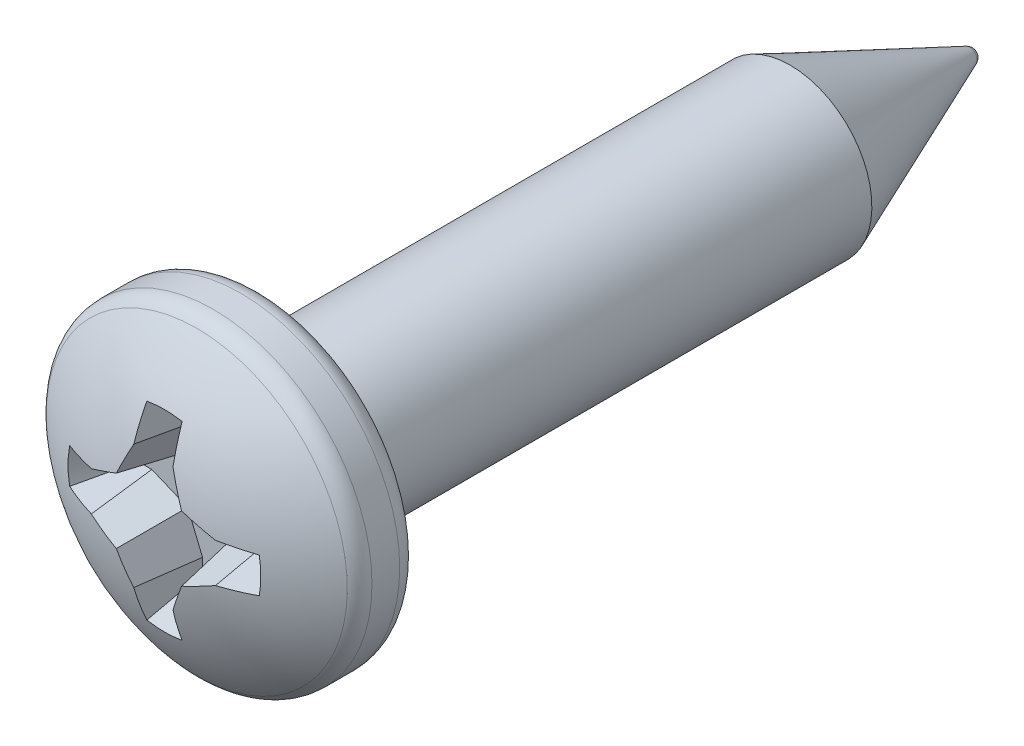
ISO-10303-21;
HEADER;
FILE_DESCRIPTION(('STEP AP214'),'2;1');
FILE_NAME('part.step','',(''),(''),'','','');
FILE_SCHEMA(('AUTOMOTIVE_DESIGN { 1 0 10303 214 1 1 1 1 }'));
ENDSEC;
DATA;
#1=APPLICATION_CONTEXT('core data for automotive mechanical design processes');
#2=APPLICATION_PROTOCOL_DEFINITION('international standard','automotive_design',2000,#1);
#3=PRODUCT_CONTEXT('',#1,'mechanical');
#4=PRODUCT('Part','Part','',(#3));
#5=PRODUCT_RELATED_PRODUCT_CATEGORY('part','',(#4));
#6=PRODUCT_DEFINITION_FORMATION('','',#4);
#7=PRODUCT_DEFINITION_CONTEXT('part definition',#1,'design');
#8=PRODUCT_DEFINITION('design','',#6,#7);
#9=PRODUCT_DEFINITION_SHAPE('','',#8);
#10=(LENGTH_UNIT() NAMED_UNIT(*) SI_UNIT(.MILLI.,.METRE.));
#11=(NAMED_UNIT(*) PLANE_ANGLE_UNIT() SI_UNIT($,.RADIAN.));
#12=(NAMED_UNIT(*) SI_UNIT($,.STERADIAN.) SOLID_ANGLE_UNIT());
#13=UNCERTAINTY_MEASURE_WITH_UNIT(LENGTH_MEASURE(1.E-05),#10,'distance_accuracy_value','');
#14=(GEOMETRIC_REPRESENTATION_CONTEXT(3) GLOBAL_UNCERTAINTY_ASSIGNED_CONTEXT((#13)) GLOBAL_UNIT_ASSIGNED_CONTEXT((#10,
#11,#12)) REPRESENTATION_CONTEXT('',''));
#15=CARTESIAN_POINT('',(0.,0.,0.));
#16=DIRECTION('',(0.,0.,1.));
#17=DIRECTION('',(1.,0.,0.));
#18=AXIS2_PLACEMENT_3D('',#15,#16,#17);
#19=CARTESIAN_POINT('',(0.,0.,0.));
#20=DIRECTION('',(0.,0.,-1.));
#21=DIRECTION('',(0.,1.,0.));
#22=AXIS2_PLACEMENT_3D('',#19,#20,#21);
#23=CYLINDRICAL_SURFACE('',#22,1.0922);
#24=CARTESIAN_POINT('',(0.,0.,0.));
#25=DIRECTION('',(0.,0.,-1.));
#26=DIRECTION('',(0.,1.,0.));
#27=AXIS2_PLACEMENT_3D('',#24,#25,#26);
#28=CIRCLE('',#27,1.0922);
#29=CARTESIAN_POINT('',(0.,1.0922,0.));
#30=VERTEX_POINT('',#29);
#31=EDGE_CURVE('E339',#30,#30,#28,.T.);
#32=ORIENTED_EDGE('',*,*,#31,.T.);
#33=EDGE_LOOP('',(#32));
#34=FACE_BOUND('',#33,.T.);
#35=CARTESIAN_POINT('',(0.,0.,-7.0588450080274));
#36=DIRECTION('',(0.,0.,-1.));
#37=DIRECTION('',(0.,1.,0.));
#38=AXIS2_PLACEMENT_3D('',#35,#36,#37);
#39=CIRCLE('',#38,1.0922);
#40=CARTESIAN_POINT('',(0.,1.0922,-7.0588450080274));
#41=VERTEX_POINT('',#40);
#42=EDGE_CURVE('E11',#41,#41,#39,.T.);
#43=ORIENTED_EDGE('',*,*,#42,.F.);
#44=EDGE_LOOP('',(#43));
#45=FACE_BOUND('',#44,.T.);
#46=ADVANCED_FACE('F17',(#34,#45),#23,.T.);
#47=CARTESIAN_POINT('',(0.,0.,-9.45749429763476));
#48=DIRECTION('',(0.,0.,1.));
#49=DIRECTION('',(0.,-1.,0.));
#50=AXIS2_PLACEMENT_3D('',#47,#48,#49);
#51=CONICAL_SURFACE('',#50,0.100940208900311,0.391882749363197);
#52=CARTESIAN_POINT('',(0.,0.,-9.45749429763476));
#53=DIRECTION('',(0.,0.,-1.));
#54=DIRECTION('',(0.,1.,0.));
#55=AXIS2_PLACEMENT_3D('',#52,#53,#54);
#56=CIRCLE('',#55,0.100940208900311);
#57=CARTESIAN_POINT('',(0.,0.100940208900313,-9.45749429763476));
#58=VERTEX_POINT('',#57);
#59=EDGE_CURVE('E26',#58,#58,#56,.T.);
#60=ORIENTED_EDGE('',*,*,#59,.F.);
#61=EDGE_LOOP('',(#60));
#62=FACE_BOUND('',#61,.T.);
#63=ORIENTED_EDGE('',*,*,#42,.T.);
#64=EDGE_LOOP('',(#63));
#65=FACE_BOUND('',#64,.T.);
#66=ADVANCED_FACE('F1027',(#62,#65),#51,.T.);
#67=CARTESIAN_POINT('',(0.,0.,-9.41578));
#68=DIRECTION('',(-1.,0.,0.));
#69=DIRECTION('',(0.,-1.,0.));
#70=AXIS2_PLACEMENT_3D('',#67,#68,#69);
#71=SPHERICAL_SURFACE('',#70,0.10922);
#72=CARTESIAN_POINT('',(0.,0.,-9.41578));
#73=DIRECTION('',(0.,0.,-1.));
#74=DIRECTION('',(0.,1.,0.));
#75=AXIS2_PLACEMENT_3D('',#72,#73,#74);
#76=SPHERICAL_SURFACE('',#75,0.10922);
#77=ORIENTED_EDGE('',*,*,#59,.T.);
#78=EDGE_LOOP('',(#77));
#79=FACE_BOUND('',#78,.T.);
#80=ADVANCED_FACE('F1018',(#79),#76,.T.);
#81=CARTESIAN_POINT('',(0.28278666666582,0.,1.5748));
#82=DIRECTION('',(-0.984807753012208,0.,0.17364817766693));
#83=DIRECTION('',(0.,1.,0.));
#84=AXIS2_PLACEMENT_3D('',#81,#82,#83);
#85=PLANE('',#84);
#86=DIRECTION('',(0.173544683499999,-0.0345201838411363,0.984220808424847));
#87=VECTOR('',#86,1.);
#88=CARTESIAN_POINT('',(0.286754779056707,-0.834865679356377,1.59730428366059));
#89=LINE('',#88,#87);
#90=CARTESIAN_POINT('',(0.124112535683148,-0.802514125691006,0.674914285714286));
#91=VERTEX_POINT('',#90);
#92=CARTESIAN_POINT('',(0.261860861000745,-0.829913971182511,1.45612385877075));
#93=VERTEX_POINT('',#92);
#94=EDGE_CURVE('E20',#91,#93,#89,.T.);
#95=ORIENTED_EDGE('',*,*,#94,.F.);
#96=DIRECTION('',(0.,1.,0.));
#97=VECTOR('',#96,1.);
#98=CARTESIAN_POINT('',(0.12411253568314,0.,0.674914285714286));
#99=LINE('',#98,#97);
#100=CARTESIAN_POINT('',(0.12411253568315,-0.986533285909944,0.674914285714286));
#101=VERTEX_POINT('',#100);
#102=EDGE_CURVE('E372',#101,#91,#99,.T.);
#103=ORIENTED_EDGE('',*,*,#102,.F.);
#104=CARTESIAN_POINT('',(0.12411253568315,-0.986533285909944,0.674914285714286));
#105=CARTESIAN_POINT('',(0.161275676182195,-1.08091285069469,0.885676928786412));
#106=CARTESIAN_POINT('',(0.198497913416884,-1.17453210642862,1.09677472610099));
#107=CARTESIAN_POINT('',(0.235747271018573,-1.26780244508165,1.30802633065989));
#108=(BOUNDED_CURVE() B_SPLINE_CURVE(3,(#104,#105,#106,#107),.UNSPECIFIED.,.F.,
.F.) B_SPLINE_CURVE_WITH_KNOTS((4,4),(0.00292428673741065,0.00362601514853769),
.UNSPECIFIED.) CURVE() GEOMETRIC_REPRESENTATION_ITEM() RATIONAL_B_SPLINE_CURVE((1.,1.,1.,1.)) REPRESENTATION_ITEM(''));
#109=CARTESIAN_POINT('',(0.235747271018573,-1.26780244508165,1.30802633065989));
#110=VERTEX_POINT('',#109);
#111=EDGE_CURVE('E386',#101,#110,#108,.T.);
#112=ORIENTED_EDGE('',*,*,#111,.T.);
#113=CARTESIAN_POINT('',(-0.281535677542724,0.,-1.62563105111396));
#114=DIRECTION('',(0.984807753012208,0.,-0.17364817766693));
#115=DIRECTION('',(0.17364817766693,0.,0.984807753012208));
#116=AXIS2_PLACEMENT_3D('',#113,#114,#115);
#117=CIRCLE('',#116,3.23747591840672);
#118=EDGE_CURVE('E292',#93,#110,#117,.T.);
#119=ORIENTED_EDGE('',*,*,#118,.F.);
#120=EDGE_LOOP('',(#95,#103,#112,#119));
#121=FACE_BOUND('',#120,.T.);
#122=ADVANCED_FACE('F1009',(#121),#85,.T.);
#123=CARTESIAN_POINT('',(0.536264047738441,-0.222127841586348,1.5748));
#124=DIRECTION('',(-0.909843726466413,0.376869611142453,0.17364817766693));
#125=DIRECTION('',(0.187471112631058,0.,0.982270116581418));
#126=AXIS2_PLACEMENT_3D('',#123,#124,#125);
#127=PLANE('',#126);
#128=DIRECTION('',(0.13256209501801,-0.132562095018007,0.982270116581418));
#129=VECTOR('',#128,1.);
#130=CARTESIAN_POINT('',(0.44196913146317,-0.44196913146316,1.55785691069535));
#131=LINE('',#130,#129);
#132=CARTESIAN_POINT('',(0.322811761028712,-0.322811761028705,0.674914285714286));
#133=VERTEX_POINT('',#132);
#134=CARTESIAN_POINT('',(0.436279560050289,-0.43627956005028,1.51569783064859));
#135=VERTEX_POINT('',#134);
#136=EDGE_CURVE('E293',#133,#135,#131,.T.);
#137=ORIENTED_EDGE('',*,*,#136,.F.);
#138=DIRECTION('',(0.38268343236508,0.923879532511291,0.));
#139=VECTOR('',#138,1.);
#140=CARTESIAN_POINT('',(0.389668265784527,-0.161405880514349,0.674914285714286));
#141=LINE('',#140,#139);
#142=EDGE_CURVE('E316',#91,#133,#141,.T.);
#143=ORIENTED_EDGE('',*,*,#142,.F.);
#144=ORIENTED_EDGE('',*,*,#94,.T.);
#145=CARTESIAN_POINT('',(0.00660582201618942,-0.00273622106972879,-1.67653414091827));
#146=DIRECTION('',(0.909843726466413,-0.376869611142454,-0.173648177666931));
#147=DIRECTION('',(-0.382683432365082,-0.92387953251129,0.));
#148=AXIS2_PLACEMENT_3D('',#145,#146,#147);
#149=CIRCLE('',#148,3.25006527753279);
#150=EDGE_CURVE('E300',#135,#93,#149,.T.);
#151=ORIENTED_EDGE('',*,*,#150,.F.);
#152=EDGE_LOOP('',(#137,#143,#144,#151));
#153=FACE_BOUND('',#152,.T.);
#154=ADVANCED_FACE('F1000',(#153),#127,.T.);
#155=CARTESIAN_POINT('',(0.22212784158636,-0.536264047738436,1.5748));
#156=DIRECTION('',(-0.376869611142473,0.909843726466405,0.17364817766693));
#157=DIRECTION('',(0.418478680382117,0.,0.908226620434372));
#158=AXIS2_PLACEMENT_3D('',#155,#156,#157);
#159=PLANE('',#158);
#160=DIRECTION('',(0.0345201838411398,-0.173544683499998,0.984220808424847));
#161=VECTOR('',#160,1.);
#162=CARTESIAN_POINT('',(0.83308245137857,-0.277789886620364,1.54646185217162));
#163=LINE('',#162,#161);
#164=CARTESIAN_POINT('',(0.802514125691008,-0.124112535683131,0.674914285714286));
#165=VERTEX_POINT('',#164);
#166=CARTESIAN_POINT('',(0.829913971182516,-0.261860861000727,1.45612385877075));
#167=VERTEX_POINT('',#166);
#168=EDGE_CURVE('E296',#165,#167,#163,.T.);
#169=ORIENTED_EDGE('',*,*,#168,.F.);
#170=DIRECTION('',(0.923879532511283,0.382683432365099,0.));
#171=VECTOR('',#170,1.);
#172=CARTESIAN_POINT('',(0.161405880514359,-0.389668265784523,0.674914285714286));
#173=LINE('',#172,#171);
#174=EDGE_CURVE('E311',#133,#165,#173,.T.);
#175=ORIENTED_EDGE('',*,*,#174,.F.);
#176=ORIENTED_EDGE('',*,*,#136,.T.);
#177=CARTESIAN_POINT('',(0.00273622106972846,-0.0066058220161897,-1.67653414091827));
#178=DIRECTION('',(0.376869611142473,-0.909843726466405,-0.17364817766693));
#179=DIRECTION('',(-0.923879532511282,-0.382683432365102,0.));
#180=AXIS2_PLACEMENT_3D('',#177,#178,#179);
#181=CIRCLE('',#180,3.25006527753279);
#182=EDGE_CURVE('E273',#167,#135,#181,.T.);
#183=ORIENTED_EDGE('',*,*,#182,.F.);
#184=EDGE_LOOP('',(#169,#175,#176,#183));
#185=FACE_BOUND('',#184,.T.);
#186=ADVANCED_FACE('F991',(#185),#159,.T.);
#187=CARTESIAN_POINT('',(0.,-0.28278666666582,1.5748));
#188=DIRECTION('',(0.,0.984807753012208,0.17364817766693));
#189=DIRECTION('',(1.,0.,0.));
#190=AXIS2_PLACEMENT_3D('',#187,#188,#189);
#191=PLANE('',#190);
#192=CARTESIAN_POINT('',(0.986533285909945,-0.124112535683129,0.674914285714286));
#193=CARTESIAN_POINT('',(1.08091458900162,-0.161276360662385,0.885680810666597));
#194=CARTESIAN_POINT('',(1.17453418753103,-0.198498744546334,1.09677943967048));
#195=CARTESIAN_POINT('',(1.26780244508165,-0.235747271018547,1.30802633065989));
#196=(BOUNDED_CURVE() B_SPLINE_CURVE(3,(#192,#193,#194,#195),.UNSPECIFIED.,.F.,
.F.) B_SPLINE_CURVE_WITH_KNOTS((4,4),(0.00112904032255537,0.00183072607387625),
.UNSPECIFIED.) CURVE() GEOMETRIC_REPRESENTATION_ITEM() RATIONAL_B_SPLINE_CURVE((1.,1.,1.,1.)) REPRESENTATION_ITEM(''));
#197=CARTESIAN_POINT('',(0.986533285909945,-0.124112535683129,0.674914285714286));
#198=VERTEX_POINT('',#197);
#199=CARTESIAN_POINT('',(1.26780244508165,-0.235747271018547,1.30802633065989));
#200=VERTEX_POINT('',#199);
#201=EDGE_CURVE('E408',#198,#200,#196,.T.);
#202=ORIENTED_EDGE('',*,*,#201,.F.);
#203=DIRECTION('',(1.,0.,0.));
#204=VECTOR('',#203,1.);
#205=CARTESIAN_POINT('',(0.,-0.12411253568314,0.674914285714286));
#206=LINE('',#205,#204);
#207=EDGE_CURVE('E315',#165,#198,#206,.T.);
#208=ORIENTED_EDGE('',*,*,#207,.F.);
#209=ORIENTED_EDGE('',*,*,#168,.T.);
#210=CARTESIAN_POINT('',(0.,0.281535677542724,-1.62563105111396));
#211=DIRECTION('',(0.,-0.984807753012208,-0.17364817766693));
#212=DIRECTION('',(0.,-0.17364817766693,0.984807753012208));
#213=AXIS2_PLACEMENT_3D('',#210,#211,#212);
#214=CIRCLE('',#213,3.23747591840672);
#215=EDGE_CURVE('E269',#200,#167,#214,.T.);
#216=ORIENTED_EDGE('',*,*,#215,.F.);
#217=EDGE_LOOP('',(#202,#208,#209,#216));
#218=FACE_BOUND('',#217,.T.);
#219=ADVANCED_FACE('F983',(#218),#191,.T.);
#220=CARTESIAN_POINT('',(0.,-0.282786666665821,1.5748));
#221=DIRECTION('',(0.,0.984807753012208,0.17364817766693));
#222=DIRECTION('',(1.,0.,0.));
#223=AXIS2_PLACEMENT_3D('',#220,#221,#222);
#224=PLANE('',#223);
#225=DIRECTION('',(-0.0345201838411369,-0.173544683499999,0.984220808424847));
#226=VECTOR('',#225,1.);
#227=CARTESIAN_POINT('',(-0.834865679356378,-0.286754779056705,1.59730428366059));
#228=LINE('',#227,#226);
#229=CARTESIAN_POINT('',(-0.802514125691006,-0.124112535683146,0.674914285714286));
#230=VERTEX_POINT('',#229);
#231=CARTESIAN_POINT('',(-0.829913971182511,-0.261860861000742,1.45612385877075));
#232=VERTEX_POINT('',#231);
#233=EDGE_CURVE('E359',#230,#232,#228,.T.);
#234=ORIENTED_EDGE('',*,*,#233,.F.);
#235=DIRECTION('',(1.,0.,0.));
#236=VECTOR('',#235,1.);
#237=CARTESIAN_POINT('',(0.,-0.12411253568314,0.674914285714286));
#238=LINE('',#237,#236);
#239=CARTESIAN_POINT('',(-0.986533285909944,-0.124112535683147,0.674914285714286));
#240=VERTEX_POINT('',#239);
#241=EDGE_CURVE('E268',#240,#230,#238,.T.);
#242=ORIENTED_EDGE('',*,*,#241,.F.);
#243=CARTESIAN_POINT('',(-0.986533285909944,-0.124112535683147,0.674914285714286));
#244=CARTESIAN_POINT('',(-1.08091285069469,-0.161275676182192,0.885676928786412));
#245=CARTESIAN_POINT('',(-1.17453210642862,-0.198497913416881,1.09677472610099));
#246=CARTESIAN_POINT('',(-1.26780244508165,-0.23574727101857,1.30802633065989));
#247=(BOUNDED_CURVE() B_SPLINE_CURVE(3,(#243,#244,#245,#246),.UNSPECIFIED.,.F.,
.F.) B_SPLINE_CURVE_WITH_KNOTS((4,4),(0.00292428673741065,0.00362601514853769),
.UNSPECIFIED.) CURVE() GEOMETRIC_REPRESENTATION_ITEM() RATIONAL_B_SPLINE_CURVE((1.,1.,1.,1.)) REPRESENTATION_ITEM(''));
#248=CARTESIAN_POINT('',(-1.26780244508165,-0.23574727101857,1.30802633065989));
#249=VERTEX_POINT('',#248);
#250=EDGE_CURVE('E452',#240,#249,#247,.T.);
#251=ORIENTED_EDGE('',*,*,#250,.T.);
#252=CARTESIAN_POINT('',(0.,0.281535677542724,-1.62563105111396));
#253=DIRECTION('',(0.,-0.984807753012208,-0.17364817766693));
#254=DIRECTION('',(0.,-0.17364817766693,0.984807753012208));
#255=AXIS2_PLACEMENT_3D('',#252,#253,#254);
#256=CIRCLE('',#255,3.23747591840672);
#257=EDGE_CURVE('E320',#232,#249,#256,.T.);
#258=ORIENTED_EDGE('',*,*,#257,.F.);
#259=EDGE_LOOP('',(#234,#242,#251,#258));
#260=FACE_BOUND('',#259,.T.);
#261=ADVANCED_FACE('F496',(#260),#224,.T.);
#262=CARTESIAN_POINT('',(-0.22212784158635,-0.53626404773844,1.5748));
#263=DIRECTION('',(0.376869611142457,0.909843726466412,0.17364817766693));
#264=DIRECTION('',(0.418478680382132,0.,-0.908226620434366));
#265=AXIS2_PLACEMENT_3D('',#262,#263,#264);
#266=PLANE('',#265);
#267=DIRECTION('',(-0.132562095018008,-0.13256209501801,0.982270116581418));
#268=VECTOR('',#267,1.);
#269=CARTESIAN_POINT('',(-0.441969131463161,-0.441969131463169,1.55785691069535));
#270=LINE('',#269,#268);
#271=CARTESIAN_POINT('',(-0.322811761028706,-0.322811761028711,0.674914285714286));
#272=VERTEX_POINT('',#271);
#273=CARTESIAN_POINT('',(-0.436279560050281,-0.436279560050288,1.51569783064859));
#274=VERTEX_POINT('',#273);
#275=EDGE_CURVE('E482',#272,#274,#270,.T.);
#276=ORIENTED_EDGE('',*,*,#275,.F.);
#277=DIRECTION('',(0.92387953251129,-0.382683432365084,0.));
#278=VECTOR('',#277,1.);
#279=CARTESIAN_POINT('',(-0.161405880514352,-0.389668265784527,0.674914285714286));
#280=LINE('',#279,#278);
#281=EDGE_CURVE('E432',#230,#272,#280,.T.);
#282=ORIENTED_EDGE('',*,*,#281,.F.);
#283=ORIENTED_EDGE('',*,*,#233,.T.);
#284=CARTESIAN_POINT('',(-0.00273622106972847,-0.00660582201619004,-1.67653414091827));
#285=DIRECTION('',(-0.376869611142457,-0.909843726466412,-0.173648177666931));
#286=DIRECTION('',(-0.923879532511289,0.382683432365085,0.));
#287=AXIS2_PLACEMENT_3D('',#284,#285,#286);
#288=CIRCLE('',#287,3.25006527753279);
#289=EDGE_CURVE('E310',#274,#232,#288,.T.);
#290=ORIENTED_EDGE('',*,*,#289,.F.);
#291=EDGE_LOOP('',(#276,#282,#283,#290));
#292=FACE_BOUND('',#291,.T.);
#293=ADVANCED_FACE('F492',(#292),#266,.T.);
#294=CARTESIAN_POINT('',(-0.536264047738437,-0.222127841586358,1.5748));
#295=DIRECTION('',(0.909843726466407,0.37686961114247,0.17364817766693));
#296=DIRECTION('',(0.,0.41847868038212,-0.908226620434371));
#297=AXIS2_PLACEMENT_3D('',#294,#295,#296);
#298=PLANE('',#297);
#299=DIRECTION('',(-0.173544683499998,-0.0345201838411393,0.984220808424847));
#300=VECTOR('',#299,1.);
#301=CARTESIAN_POINT('',(-0.277789886620367,-0.833082451378569,1.54646185217162));
#302=LINE('',#301,#300);
#303=CARTESIAN_POINT('',(-0.124112535683134,-0.802514125691009,0.674914285714286));
#304=VERTEX_POINT('',#303);
#305=CARTESIAN_POINT('',(-0.26186086100073,-0.829913971182516,1.45612385877075));
#306=VERTEX_POINT('',#305);
#307=EDGE_CURVE('E385',#304,#306,#302,.T.);
#308=ORIENTED_EDGE('',*,*,#307,.F.);
#309=DIRECTION('',(0.382683432365096,-0.923879532511284,0.));
#310=VECTOR('',#309,1.);
#311=CARTESIAN_POINT('',(-0.389668265784523,-0.161405880514356,0.674914285714286));
#312=LINE('',#311,#310);
#313=EDGE_CURVE('E436',#272,#304,#312,.T.);
#314=ORIENTED_EDGE('',*,*,#313,.F.);
#315=ORIENTED_EDGE('',*,*,#275,.T.);
#316=CARTESIAN_POINT('',(-0.00660582201618928,-0.00273622106972887,-1.67653414091827));
#317=DIRECTION('',(-0.909843726466407,-0.37686961114247,-0.17364817766693));
#318=DIRECTION('',(-0.382683432365099,0.923879532511283,0.));
#319=AXIS2_PLACEMENT_3D('',#316,#317,#318);
#320=CIRCLE('',#319,3.25006527753279);
#321=EDGE_CURVE('E278',#306,#274,#320,.T.);
#322=ORIENTED_EDGE('',*,*,#321,.F.);
#323=EDGE_LOOP('',(#308,#314,#315,#322));
#324=FACE_BOUND('',#323,.T.);
#325=ADVANCED_FACE('F501',(#324),#298,.T.);
#326=CARTESIAN_POINT('',(-0.28278666666582,0.,1.5748));
#327=DIRECTION('',(0.984807753012208,0.,0.17364817766693));
#328=DIRECTION('',(0.,-1.,0.));
#329=AXIS2_PLACEMENT_3D('',#326,#327,#328);
#330=PLANE('',#329);
#331=CARTESIAN_POINT('',(-0.124112535683132,-0.986533285909946,0.674914285714286));
#332=CARTESIAN_POINT('',(-0.161276360662388,-1.08091458900162,0.885680810666597));
#333=CARTESIAN_POINT('',(-0.198498744546339,-1.17453418753103,1.09677943967048));
#334=CARTESIAN_POINT('',(-0.235747271018551,-1.26780244508165,1.30802633065989));
#335=(BOUNDED_CURVE() B_SPLINE_CURVE(3,(#331,#332,#333,#334),.UNSPECIFIED.,.F.,
.F.) B_SPLINE_CURVE_WITH_KNOTS((4,4),(0.00112904032255537,0.00183072607387625),
.UNSPECIFIED.) CURVE() GEOMETRIC_REPRESENTATION_ITEM() RATIONAL_B_SPLINE_CURVE((1.,1.,1.,1.)) REPRESENTATION_ITEM(''));
#336=CARTESIAN_POINT('',(-0.124112535683132,-0.986533285909946,0.674914285714286));
#337=VERTEX_POINT('',#336);
#338=CARTESIAN_POINT('',(-0.235747271018551,-1.26780244508165,1.30802633065989));
#339=VERTEX_POINT('',#338);
#340=EDGE_CURVE('E380',#337,#339,#335,.T.);
#341=ORIENTED_EDGE('',*,*,#340,.F.);
#342=DIRECTION('',(0.,-1.,0.));
#343=VECTOR('',#342,1.);
#344=CARTESIAN_POINT('',(-0.124112535683139,0.,0.674914285714286));
#345=LINE('',#344,#343);
#346=EDGE_CURVE('E373',#304,#337,#345,.T.);
#347=ORIENTED_EDGE('',*,*,#346,.F.);
#348=ORIENTED_EDGE('',*,*,#307,.T.);
#349=CARTESIAN_POINT('',(0.281535677542725,0.,-1.62563105111396));
#350=DIRECTION('',(-0.984807753012208,0.,-0.173648177666931));
#351=DIRECTION('',(0.173648177666931,0.,-0.984807753012208));
#352=AXIS2_PLACEMENT_3D('',#349,#350,#351);
#353=CIRCLE('',#352,3.23747591840672);
#354=EDGE_CURVE('E275',#339,#306,#353,.T.);
#355=ORIENTED_EDGE('',*,*,#354,.F.);
#356=EDGE_LOOP('',(#341,#347,#348,#355));
#357=FACE_BOUND('',#356,.T.);
#358=ADVANCED_FACE('F907',(#357),#330,.T.);
#359=CARTESIAN_POINT('',(0.,0.,1.5748));
#360=DIRECTION('',(0.,0.,1.));
#361=DIRECTION('',(1.,0.,0.));
#362=AXIS2_PLACEMENT_3D('',#359,#360,#361);
#363=CONICAL_SURFACE('',#362,1.4139333333291,0.436332312998583);
#364=ORIENTED_EDGE('',*,*,#111,.F.);
#365=CARTESIAN_POINT('',(0.,0.,0.674914285714286));
#366=DIRECTION('',(0.,0.,1.));
#367=DIRECTION('',(1.,0.,0.));
#368=AXIS2_PLACEMENT_3D('',#365,#366,#367);
#369=CIRCLE('',#368,0.994309733293389);
#370=EDGE_CURVE('E368',#337,#101,#369,.T.);
#371=ORIENTED_EDGE('',*,*,#370,.F.);
#372=ORIENTED_EDGE('',*,*,#340,.T.);
#373=CARTESIAN_POINT('',(0.,0.,1.30802633065989));
#374=DIRECTION('',(0.,0.,-1.));
#375=DIRECTION('',(-1.,0.,0.));
#376=AXIS2_PLACEMENT_3D('',#373,#374,#375);
#377=CIRCLE('',#376,1.2895347283217);
#378=EDGE_CURVE('E279',#110,#339,#377,.T.);
#379=ORIENTED_EDGE('',*,*,#378,.F.);
#380=EDGE_LOOP('',(#364,#371,#372,#379));
#381=FACE_BOUND('',#380,.T.);
#382=ADVANCED_FACE('F911',(#381),#363,.F.);
#383=CARTESIAN_POINT('',(-0.28278666666582,0.,1.5748));
#384=DIRECTION('',(0.984807753012208,0.,0.17364817766693));
#385=DIRECTION('',(0.,-1.,0.));
#386=AXIS2_PLACEMENT_3D('',#383,#384,#385);
#387=PLANE('',#386);
#388=DIRECTION('',(-0.173544683499999,0.0345201838411375,0.984220808424847));
#389=VECTOR('',#388,1.);
#390=CARTESIAN_POINT('',(-0.286754779056702,0.834865679356378,1.59730428366059));
#391=LINE('',#390,#389);
#392=CARTESIAN_POINT('',(-0.124112535683143,0.802514125691005,0.674914285714286));
#393=VERTEX_POINT('',#392);
#394=CARTESIAN_POINT('',(-0.261860861000739,0.829913971182511,1.45612385877075));
#395=VERTEX_POINT('',#394);
#396=EDGE_CURVE('E470',#393,#395,#391,.T.);
#397=ORIENTED_EDGE('',*,*,#396,.F.);
#398=DIRECTION('',(0.,-1.,0.));
#399=VECTOR('',#398,1.);
#400=CARTESIAN_POINT('',(-0.12411253568314,0.,0.674914285714286));
#401=LINE('',#400,#399);
#402=CARTESIAN_POINT('',(-0.124112535683143,0.986533285909944,0.674914285714286));
#403=VERTEX_POINT('',#402);
#404=EDGE_CURVE('E407',#403,#393,#401,.T.);
#405=ORIENTED_EDGE('',*,*,#404,.F.);
#406=CARTESIAN_POINT('',(-0.124112535683143,0.986533285909944,0.674914285714286));
#407=CARTESIAN_POINT('',(-0.161275676182187,1.08091285069469,0.885676928786412));
#408=CARTESIAN_POINT('',(-0.198497913416876,1.17453210642862,1.09677472610099));
#409=CARTESIAN_POINT('',(-0.235747271018565,1.26780244508165,1.30802633065989));
#410=(BOUNDED_CURVE() B_SPLINE_CURVE(3,(#406,#407,#408,#409),.UNSPECIFIED.,.F.,
.F.) B_SPLINE_CURVE_WITH_KNOTS((4,4),(0.00292428673741065,0.00362601514853769),
.UNSPECIFIED.) CURVE() GEOMETRIC_REPRESENTATION_ITEM() RATIONAL_B_SPLINE_CURVE((1.,1.,1.,1.)) REPRESENTATION_ITEM(''));
#411=CARTESIAN_POINT('',(-0.235747271018565,1.26780244508165,1.30802633065989));
#412=VERTEX_POINT('',#411);
#413=EDGE_CURVE('E342',#403,#412,#410,.T.);
#414=ORIENTED_EDGE('',*,*,#413,.T.);
#415=CARTESIAN_POINT('',(0.281535677542724,0.,-1.62563105111396));
#416=DIRECTION('',(-0.984807753012208,0.,-0.17364817766693));
#417=DIRECTION('',(0.17364817766693,0.,-0.984807753012208));
#418=AXIS2_PLACEMENT_3D('',#415,#416,#417);
#419=CIRCLE('',#418,3.23747591840672);
#420=EDGE_CURVE('E257',#395,#412,#419,.T.);
#421=ORIENTED_EDGE('',*,*,#420,.F.);
#422=EDGE_LOOP('',(#397,#405,#414,#421));
#423=FACE_BOUND('',#422,.T.);
#424=ADVANCED_FACE('F818',(#423),#387,.T.);
#425=CARTESIAN_POINT('',(-0.536264047738439,0.222127841586352,1.5748));
#426=DIRECTION('',(0.909843726466411,-0.37686961114246,0.173648177666931));
#427=DIRECTION('',(0.,-0.418478680382129,-0.908226620434367));
#428=AXIS2_PLACEMENT_3D('',#425,#426,#427);
#429=PLANE('',#428);
#430=DIRECTION('',(-0.132562095018009,0.132562095018008,0.982270116581418));
#431=VECTOR('',#430,1.);
#432=CARTESIAN_POINT('',(-0.441969131463166,0.441969131463163,1.55785691069535));
#433=LINE('',#432,#431);
#434=CARTESIAN_POINT('',(-0.32281176102871,0.322811761028706,0.674914285714286));
#435=VERTEX_POINT('',#434);
#436=CARTESIAN_POINT('',(-0.436279560050286,0.436279560050282,1.51569783064859));
#437=VERTEX_POINT('',#436);
#438=EDGE_CURVE('E467',#435,#437,#433,.T.);
#439=ORIENTED_EDGE('',*,*,#438,.F.);
#440=DIRECTION('',(-0.382683432365087,-0.923879532511288,0.));
#441=VECTOR('',#440,1.);
#442=CARTESIAN_POINT('',(-0.389668265784525,0.161405880514353,0.674914285714286));
#443=LINE('',#442,#441);
#444=EDGE_CURVE('E399',#393,#435,#443,.T.);
#445=ORIENTED_EDGE('',*,*,#444,.F.);
#446=ORIENTED_EDGE('',*,*,#396,.T.);
#447=CARTESIAN_POINT('',(-0.0066058220161894,0.00273622106972798,-1.67653414091827));
#448=DIRECTION('',(-0.909843726466411,0.37686961114246,-0.17364817766693));
#449=DIRECTION('',(0.382683432365089,0.923879532511287,0.));
#450=AXIS2_PLACEMENT_3D('',#447,#448,#449);
#451=CIRCLE('',#450,3.25006527753279);
#452=EDGE_CURVE('E336',#437,#395,#451,.T.);
#453=ORIENTED_EDGE('',*,*,#452,.F.);
#454=EDGE_LOOP('',(#439,#445,#446,#453));
#455=FACE_BOUND('',#454,.T.);
#456=ADVANCED_FACE('F813',(#455),#429,.T.);
#457=CARTESIAN_POINT('',(-0.222127841586356,0.536264047738437,1.5748));
#458=DIRECTION('',(0.376869611142466,-0.909843726466408,0.17364817766693));
#459=DIRECTION('',(0.,-0.187471112631059,-0.982270116581418));
#460=AXIS2_PLACEMENT_3D('',#457,#458,#459);
#461=PLANE('',#460);
#462=DIRECTION('',(-0.0345201838411388,0.173544683499998,0.984220808424847));
#463=VECTOR('',#462,1.);
#464=CARTESIAN_POINT('',(-0.833082451378568,0.277789886620369,1.54646185217162));
#465=LINE('',#464,#463);
#466=CARTESIAN_POINT('',(-0.802514125691008,0.124112535683136,0.674914285714286));
#467=VERTEX_POINT('',#466);
#468=CARTESIAN_POINT('',(-0.829913971182514,0.261860861000732,1.45612385877075));
#469=VERTEX_POINT('',#468);
#470=EDGE_CURVE('E451',#467,#469,#465,.T.);
#471=ORIENTED_EDGE('',*,*,#470,.F.);
#472=DIRECTION('',(-0.923879532511285,-0.382683432365093,0.));
#473=VECTOR('',#472,1.);
#474=CARTESIAN_POINT('',(-0.161405880514355,0.389668265784523,0.674914285714286));
#475=LINE('',#474,#473);
#476=EDGE_CURVE('E406',#435,#467,#475,.T.);
#477=ORIENTED_EDGE('',*,*,#476,.F.);
#478=ORIENTED_EDGE('',*,*,#438,.T.);
#479=CARTESIAN_POINT('',(-0.00273622106972837,0.00660582201618875,-1.67653414091827));
#480=DIRECTION('',(-0.376869611142467,0.909843726466408,-0.173648177666931));
#481=DIRECTION('',(0.923879532511284,0.382683432365095,0.));
#482=AXIS2_PLACEMENT_3D('',#479,#480,#481);
#483=CIRCLE('',#482,3.25006527753279);
#484=EDGE_CURVE('E332',#469,#437,#483,.T.);
#485=ORIENTED_EDGE('',*,*,#484,.F.);
#486=EDGE_LOOP('',(#471,#477,#478,#485));
#487=FACE_BOUND('',#486,.T.);
#488=ADVANCED_FACE('F817',(#487),#461,.T.);
#489=CARTESIAN_POINT('',(0.,0.282786666665819,1.5748));
#490=DIRECTION('',(0.,-0.984807753012208,0.17364817766693));
#491=DIRECTION('',(-1.,0.,0.));
#492=AXIS2_PLACEMENT_3D('',#489,#490,#491);
#493=PLANE('',#492);
#494=CARTESIAN_POINT('',(-0.986533285909945,0.124112535683135,0.674914285714286));
#495=CARTESIAN_POINT('',(-1.08091458900162,0.161276360662391,0.885680810666597));
#496=CARTESIAN_POINT('',(-1.17453418753103,0.198498744546342,1.09677943967048));
#497=CARTESIAN_POINT('',(-1.26780244508165,0.235747271018555,1.30802633065989));
#498=(BOUNDED_CURVE() B_SPLINE_CURVE(3,(#494,#495,#496,#497),.UNSPECIFIED.,.F.,
.F.) B_SPLINE_CURVE_WITH_KNOTS((4,4),(0.00112904032255537,0.00183072607387625),
.UNSPECIFIED.) CURVE() GEOMETRIC_REPRESENTATION_ITEM() RATIONAL_B_SPLINE_CURVE((1.,1.,1.,1.)) REPRESENTATION_ITEM(''));
#499=CARTESIAN_POINT('',(-0.986533285909945,0.124112535683135,0.674914285714286));
#500=VERTEX_POINT('',#499);
#501=CARTESIAN_POINT('',(-1.26780244508165,0.235747271018555,1.30802633065989));
#502=VERTEX_POINT('',#501);
#503=EDGE_CURVE('E446',#500,#502,#498,.T.);
#504=ORIENTED_EDGE('',*,*,#503,.F.);
#505=DIRECTION('',(-1.,0.,0.));
#506=VECTOR('',#505,1.);
#507=CARTESIAN_POINT('',(0.,0.124112535683139,0.674914285714286));
#508=LINE('',#507,#506);
#509=EDGE_CURVE('E424',#467,#500,#508,.T.);
#510=ORIENTED_EDGE('',*,*,#509,.F.);
#511=ORIENTED_EDGE('',*,*,#470,.T.);
#512=CARTESIAN_POINT('',(0.,-0.281535677542725,-1.62563105111396));
#513=DIRECTION('',(0.,0.984807753012208,-0.173648177666931));
#514=DIRECTION('',(0.,-0.173648177666931,-0.984807753012208));
#515=AXIS2_PLACEMENT_3D('',#512,#513,#514);
#516=CIRCLE('',#515,3.23747591840672);
#517=EDGE_CURVE('E328',#502,#469,#516,.T.);
#518=ORIENTED_EDGE('',*,*,#517,.F.);
#519=EDGE_LOOP('',(#504,#510,#511,#518));
#520=FACE_BOUND('',#519,.T.);
#521=ADVANCED_FACE('F850',(#520),#493,.T.);
#522=CARTESIAN_POINT('',(0.,0.,1.5748));
#523=DIRECTION('',(0.,0.,1.));
#524=DIRECTION('',(1.,0.,0.));
#525=AXIS2_PLACEMENT_3D('',#522,#523,#524);
#526=CONICAL_SURFACE('',#525,1.4139333333291,0.436332312998583);
#527=ORIENTED_EDGE('',*,*,#250,.F.);
#528=CARTESIAN_POINT('',(0.,0.,0.674914285714286));
#529=DIRECTION('',(0.,0.,1.));
#530=DIRECTION('',(1.,0.,0.));
#531=AXIS2_PLACEMENT_3D('',#528,#529,#530);
#532=CIRCLE('',#531,0.994309733293389);
#533=EDGE_CURVE('E428',#500,#240,#532,.T.);
#534=ORIENTED_EDGE('',*,*,#533,.F.);
#535=ORIENTED_EDGE('',*,*,#503,.T.);
#536=CARTESIAN_POINT('',(0.,0.,1.30802633065989));
#537=DIRECTION('',(0.,0.,-1.));
#538=DIRECTION('',(-1.,0.,0.));
#539=AXIS2_PLACEMENT_3D('',#536,#537,#538);
#540=CIRCLE('',#539,1.2895347283217);
#541=EDGE_CURVE('E324',#249,#502,#540,.T.);
#542=ORIENTED_EDGE('',*,*,#541,.F.);
#543=EDGE_LOOP('',(#527,#534,#535,#542));
#544=FACE_BOUND('',#543,.T.);
#545=ADVANCED_FACE('F854',(#544),#526,.F.);
#546=CARTESIAN_POINT('',(0.,0.,0.674914285714286));
#547=DIRECTION('',(0.,0.,1.));
#548=DIRECTION('',(1.,0.,0.));
#549=AXIS2_PLACEMENT_3D('',#546,#547,#548);
#550=PLANE('',#549);
#551=CARTESIAN_POINT('',(0.,0.,0.674914285714286));
#552=DIRECTION('',(0.,0.,1.));
#553=DIRECTION('',(1.,0.,0.));
#554=AXIS2_PLACEMENT_3D('',#551,#552,#553);
#555=CIRCLE('',#554,0.994309733293389);
#556=CARTESIAN_POINT('',(0.124112535683139,0.986533285909944,0.674914285714286));
#557=VERTEX_POINT('',#556);
#558=EDGE_CURVE('E236',#557,#403,#555,.T.);
#559=ORIENTED_EDGE('',*,*,#558,.T.);
#560=ORIENTED_EDGE('',*,*,#404,.T.);
#561=ORIENTED_EDGE('',*,*,#444,.T.);
#562=ORIENTED_EDGE('',*,*,#476,.T.);
#563=ORIENTED_EDGE('',*,*,#509,.T.);
#564=ORIENTED_EDGE('',*,*,#533,.T.);
#565=ORIENTED_EDGE('',*,*,#241,.T.);
#566=ORIENTED_EDGE('',*,*,#281,.T.);
#567=ORIENTED_EDGE('',*,*,#313,.T.);
#568=ORIENTED_EDGE('',*,*,#346,.T.);
#569=ORIENTED_EDGE('',*,*,#370,.T.);
#570=ORIENTED_EDGE('',*,*,#102,.T.);
#571=ORIENTED_EDGE('',*,*,#142,.T.);
#572=ORIENTED_EDGE('',*,*,#174,.T.);
#573=ORIENTED_EDGE('',*,*,#207,.T.);
#574=CARTESIAN_POINT('',(0.,0.,0.674914285714286));
#575=DIRECTION('',(0.,0.,1.));
#576=DIRECTION('',(1.,0.,0.));
#577=AXIS2_PLACEMENT_3D('',#574,#575,#576);
#578=CIRCLE('',#577,0.994309733293389);
#579=CARTESIAN_POINT('',(0.986533285909944,0.124112535683139,0.674914285714286));
#580=VERTEX_POINT('',#579);
#581=EDGE_CURVE('E398',#198,#580,#578,.T.);
#582=ORIENTED_EDGE('',*,*,#581,.T.);
#583=DIRECTION('',(-1.,0.,0.));
#584=VECTOR('',#583,1.);
#585=CARTESIAN_POINT('',(0.,0.124112535683139,0.674914285714286));
#586=LINE('',#585,#584);
#587=CARTESIAN_POINT('',(0.802514125691007,0.124112535683139,0.674914285714286));
#588=VERTEX_POINT('',#587);
#589=EDGE_CURVE('E387',#580,#588,#586,.T.);
#590=ORIENTED_EDGE('',*,*,#589,.T.);
#591=DIRECTION('',(-0.923879532511287,0.38268343236509,0.));
#592=VECTOR('',#591,1.);
#593=CARTESIAN_POINT('',(0.161405880514354,0.389668265784525,0.674914285714286));
#594=LINE('',#593,#592);
#595=CARTESIAN_POINT('',(0.322811761028708,0.322811761028708,0.674914285714286));
#596=VERTEX_POINT('',#595);
#597=EDGE_CURVE('E376',#588,#596,#594,.T.);
#598=ORIENTED_EDGE('',*,*,#597,.T.);
#599=DIRECTION('',(-0.38268343236509,0.923879532511287,0.));
#600=VECTOR('',#599,1.);
#601=CARTESIAN_POINT('',(0.389668265784525,0.161405880514354,0.674914285714286));
#602=LINE('',#601,#600);
#603=CARTESIAN_POINT('',(0.124112535683139,0.802514125691007,0.674914285714286));
#604=VERTEX_POINT('',#603);
#605=EDGE_CURVE('E364',#596,#604,#602,.T.);
#606=ORIENTED_EDGE('',*,*,#605,.T.);
#607=DIRECTION('',(0.,1.,0.));
#608=VECTOR('',#607,1.);
#609=CARTESIAN_POINT('',(0.124112535683139,0.,0.674914285714286));
#610=LINE('',#609,#608);
#611=EDGE_CURVE('E240',#604,#557,#610,.T.);
#612=ORIENTED_EDGE('',*,*,#611,.T.);
#613=EDGE_LOOP('',(#559,#560,#561,#562,#563,#564,#565,#566,#567,#568,#569,#570,#571,#572,#573,
#582,#590,#598,#606,#612));
#614=FACE_BOUND('',#613,.T.);
#615=ADVANCED_FACE('F506',(#614),#550,.T.);
#616=CARTESIAN_POINT('',(0.,0.,1.5748));
#617=DIRECTION('',(0.,0.,1.));
#618=DIRECTION('',(1.,0.,0.));
#619=AXIS2_PLACEMENT_3D('',#616,#617,#618);
#620=CONICAL_SURFACE('',#619,1.4139333333291,0.436332312998583);
#621=CARTESIAN_POINT('',(0.986533285909944,0.124112535683139,0.674914285714286));
#622=CARTESIAN_POINT('',(1.08091285069469,0.161275676182183,0.885676928786412));
#623=CARTESIAN_POINT('',(1.17453210642862,0.198497913416871,1.09677472610099));
#624=CARTESIAN_POINT('',(1.26780244508165,0.23574727101856,1.30802633065989));
#625=(BOUNDED_CURVE() B_SPLINE_CURVE(3,(#621,#622,#623,#624),.UNSPECIFIED.,.F.,
.F.) B_SPLINE_CURVE_WITH_KNOTS((4,4),(0.00292428673741064,0.00362601514853769),
.UNSPECIFIED.) CURVE() GEOMETRIC_REPRESENTATION_ITEM() RATIONAL_B_SPLINE_CURVE((1.,1.,1.,1.)) REPRESENTATION_ITEM(''));
#626=CARTESIAN_POINT('',(1.26780244508165,0.23574727101856,1.30802633065989));
#627=VERTEX_POINT('',#626);
#628=EDGE_CURVE('E393',#580,#627,#625,.T.);
#629=ORIENTED_EDGE('',*,*,#628,.F.);
#630=ORIENTED_EDGE('',*,*,#581,.F.);
#631=ORIENTED_EDGE('',*,*,#201,.T.);
#632=CARTESIAN_POINT('',(0.,0.,1.30802633065989));
#633=DIRECTION('',(0.,0.,-1.));
#634=DIRECTION('',(-1.,0.,0.));
#635=AXIS2_PLACEMENT_3D('',#632,#633,#634);
#636=CIRCLE('',#635,1.2895347283217);
#637=EDGE_CURVE('E274',#627,#200,#636,.T.);
#638=ORIENTED_EDGE('',*,*,#637,.F.);
#639=EDGE_LOOP('',(#629,#630,#631,#638));
#640=FACE_BOUND('',#639,.T.);
#641=ADVANCED_FACE('F832',(#640),#620,.F.);
#642=CARTESIAN_POINT('',(0.,0.28278666666582,1.5748));
#643=DIRECTION('',(0.,-0.984807753012208,0.17364817766693));
#644=DIRECTION('',(-1.,0.,0.));
#645=AXIS2_PLACEMENT_3D('',#642,#643,#644);
#646=PLANE('',#645);
#647=DIRECTION('',(0.0345201838411381,0.173544683499998,0.984220808424847));
#648=VECTOR('',#647,1.);
#649=CARTESIAN_POINT('',(0.83486567935638,0.286754779056698,1.59730428366059));
#650=LINE('',#649,#648);
#651=CARTESIAN_POINT('',(0.829913971182513,0.261860861000736,1.45612385877075));
#652=VERTEX_POINT('',#651);
#653=EDGE_CURVE('E379',#588,#652,#650,.T.);
#654=ORIENTED_EDGE('',*,*,#653,.F.);
#655=ORIENTED_EDGE('',*,*,#589,.F.);
#656=ORIENTED_EDGE('',*,*,#628,.T.);
#657=CARTESIAN_POINT('',(0.,-0.281535677542724,-1.62563105111396));
#658=DIRECTION('',(0.,0.984807753012208,-0.17364817766693));
#659=DIRECTION('',(0.,-0.17364817766693,-0.984807753012208));
#660=AXIS2_PLACEMENT_3D('',#657,#658,#659);
#661=CIRCLE('',#660,3.23747591840672);
#662=EDGE_CURVE('E281',#652,#627,#661,.T.);
#663=ORIENTED_EDGE('',*,*,#662,.F.);
#664=EDGE_LOOP('',(#654,#655,#656,#663));
#665=FACE_BOUND('',#664,.T.);
#666=ADVANCED_FACE('F836',(#665),#646,.T.);
#667=CARTESIAN_POINT('',(0.222127841586354,0.536264047738438,1.5748));
#668=DIRECTION('',(-0.376869611142463,-0.90984372646641,0.17364817766693));
#669=DIRECTION('',(-0.923879532511287,0.38268343236509,0.));
#670=AXIS2_PLACEMENT_3D('',#667,#668,#669);
#671=PLANE('',#670);
#672=DIRECTION('',(0.132562095018009,0.132562095018009,0.982270116581418));
#673=VECTOR('',#672,1.);
#674=CARTESIAN_POINT('',(0.441969131463165,0.441969131463164,1.55785691069535));
#675=LINE('',#674,#673);
#676=CARTESIAN_POINT('',(0.436279560050284,0.436279560050284,1.51569783064859));
#677=VERTEX_POINT('',#676);
#678=EDGE_CURVE('E367',#596,#677,#675,.T.);
#679=ORIENTED_EDGE('',*,*,#678,.F.);
#680=ORIENTED_EDGE('',*,*,#597,.F.);
#681=ORIENTED_EDGE('',*,*,#653,.T.);
#682=CARTESIAN_POINT('',(0.00273622106972839,0.00660582201618886,-1.67653414091827));
#683=DIRECTION('',(0.376869611142463,0.909843726466409,-0.17364817766693));
#684=DIRECTION('',(0.923879532511287,-0.382683432365089,0.));
#685=AXIS2_PLACEMENT_3D('',#682,#683,#684);
#686=CIRCLE('',#685,3.25006527753279);
#687=EDGE_CURVE('E285',#677,#652,#686,.T.);
#688=ORIENTED_EDGE('',*,*,#687,.F.);
#689=EDGE_LOOP('',(#679,#680,#681,#688));
#690=FACE_BOUND('',#689,.T.);
#691=ADVANCED_FACE('F920',(#690),#671,.T.);
#692=CARTESIAN_POINT('',(0.536264047738438,0.222127841586354,1.5748));
#693=DIRECTION('',(-0.909843726466409,-0.376869611142463,0.173648177666931));
#694=DIRECTION('',(-0.38268343236509,0.923879532511287,0.));
#695=AXIS2_PLACEMENT_3D('',#692,#693,#694);
#696=PLANE('',#695);
#697=DIRECTION('',(0.173544683499998,0.0345201838411381,0.984220808424847));
#698=VECTOR('',#697,1.);
#699=CARTESIAN_POINT('',(0.277789886620372,0.833082451378566,1.54646185217162));
#700=LINE('',#699,#698);
#701=CARTESIAN_POINT('',(0.261860861000735,0.829913971182513,1.45612385877075));
#702=VERTEX_POINT('',#701);
#703=EDGE_CURVE('E246',#604,#702,#700,.T.);
#704=ORIENTED_EDGE('',*,*,#703,.F.);
#705=ORIENTED_EDGE('',*,*,#605,.F.);
#706=ORIENTED_EDGE('',*,*,#678,.T.);
#707=CARTESIAN_POINT('',(0.0066058220161892,0.00273622106972791,-1.67653414091827));
#708=DIRECTION('',(0.909843726466409,0.376869611142463,-0.17364817766693));
#709=DIRECTION('',(0.382683432365094,-0.923879532511285,0.));
#710=AXIS2_PLACEMENT_3D('',#707,#708,#709);
#711=CIRCLE('',#710,3.25006527753279);
#712=EDGE_CURVE('E251',#702,#677,#711,.T.);
#713=ORIENTED_EDGE('',*,*,#712,.F.);
#714=EDGE_LOOP('',(#704,#705,#706,#713));
#715=FACE_BOUND('',#714,.T.);
#716=ADVANCED_FACE('F895',(#715),#696,.T.);
#717=CARTESIAN_POINT('',(0.28278666666582,0.,1.5748));
#718=DIRECTION('',(-0.984807753012208,0.,0.17364817766693));
#719=DIRECTION('',(0.,1.,0.));
#720=AXIS2_PLACEMENT_3D('',#717,#718,#719);
#721=PLANE('',#720);
#722=CARTESIAN_POINT('',(0.124112535683139,0.986533285909944,0.674914285714286));
#723=CARTESIAN_POINT('',(0.161276360662396,1.08091458900161,0.885680810666597));
#724=CARTESIAN_POINT('',(0.198498744546347,1.17453418753103,1.09677943967048));
#725=CARTESIAN_POINT('',(0.23574727101856,1.26780244508165,1.30802633065989));
#726=(BOUNDED_CURVE() B_SPLINE_CURVE(3,(#722,#723,#724,#725),.UNSPECIFIED.,.F.,
.F.) B_SPLINE_CURVE_WITH_KNOTS((4,4),(0.00112904032255536,0.00183072607387625),
.UNSPECIFIED.) CURVE() GEOMETRIC_REPRESENTATION_ITEM() RATIONAL_B_SPLINE_CURVE((1.,1.,1.,1.)) REPRESENTATION_ITEM(''));
#727=CARTESIAN_POINT('',(0.23574727101856,1.26780244508165,1.30802633065989));
#728=VERTEX_POINT('',#727);
#729=EDGE_CURVE('E228',#557,#728,#726,.T.);
#730=ORIENTED_EDGE('',*,*,#729,.F.);
#731=ORIENTED_EDGE('',*,*,#611,.F.);
#732=ORIENTED_EDGE('',*,*,#703,.T.);
#733=CARTESIAN_POINT('',(-0.281535677542725,0.,-1.62563105111396));
#734=DIRECTION('',(0.984807753012208,0.,-0.17364817766693));
#735=DIRECTION('',(0.17364817766693,0.,0.984807753012208));
#736=AXIS2_PLACEMENT_3D('',#733,#734,#735);
#737=CIRCLE('',#736,3.23747591840672);
#738=EDGE_CURVE('E243',#728,#702,#737,.T.);
#739=ORIENTED_EDGE('',*,*,#738,.F.);
#740=EDGE_LOOP('',(#730,#731,#732,#739));
#741=FACE_BOUND('',#740,.T.);
#742=ADVANCED_FACE('F244',(#741),#721,.T.);
#743=CARTESIAN_POINT('',(0.,0.,1.5748));
#744=DIRECTION('',(0.,0.,1.));
#745=DIRECTION('',(1.,0.,0.));
#746=AXIS2_PLACEMENT_3D('',#743,#744,#745);
#747=CONICAL_SURFACE('',#746,1.4139333333291,0.436332312998583);
#748=CARTESIAN_POINT('',(0.,0.,1.30802633065989));
#749=DIRECTION('',(0.,0.,-1.));
#750=DIRECTION('',(-1.,0.,0.));
#751=AXIS2_PLACEMENT_3D('',#748,#749,#750);
#752=CIRCLE('',#751,1.2895347283217);
#753=EDGE_CURVE('E233',#412,#728,#752,.T.);
#754=ORIENTED_EDGE('',*,*,#753,.F.);
#755=ORIENTED_EDGE('',*,*,#413,.F.);
#756=ORIENTED_EDGE('',*,*,#558,.F.);
#757=ORIENTED_EDGE('',*,*,#729,.T.);
#758=EDGE_LOOP('',(#754,#755,#756,#757));
#759=FACE_BOUND('',#758,.T.);
#760=ADVANCED_FACE('F230',(#759),#747,.F.);
#761=CARTESIAN_POINT('',(0.,0.,0.));
#762=DIRECTION('',(0.,0.,1.));
#763=DIRECTION('',(1.,0.,0.));
#764=AXIS2_PLACEMENT_3D('',#761,#762,#763);
#765=PLANE('',#764);
#766=ORIENTED_EDGE('',*,*,#31,.F.);
#767=EDGE_LOOP('',(#766));
#768=FACE_BOUND('',#767,.T.);
#769=CARTESIAN_POINT('',(0.,0.,0.));
#770=DIRECTION('',(0.,0.,-1.));
#771=DIRECTION('',(0.,1.,0.));
#772=AXIS2_PLACEMENT_3D('',#769,#770,#771);
#773=CIRCLE('',#772,1.837436);
#774=CARTESIAN_POINT('',(0.,1.837436,0.));
#775=VERTEX_POINT('',#774);
#776=EDGE_CURVE('E1392',#775,#775,#773,.T.);
#777=ORIENTED_EDGE('',*,*,#776,.T.);
#778=EDGE_LOOP('',(#777));
#779=FACE_BOUND('',#778,.T.);
#780=ADVANCED_FACE('F863',(#768,#779),#765,.F.);
#781=CARTESIAN_POINT('',(0.,0.,0.65380372659326));
#782=DIRECTION('',(0.,0.,-1.));
#783=DIRECTION('',(0.,1.,0.));
#784=AXIS2_PLACEMENT_3D('',#781,#782,#783);
#785=TOROIDAL_SURFACE('',#784,1.837436,0.283464);
#786=CARTESIAN_POINT('',(0.,0.,0.653803726593259));
#787=DIRECTION('',(0.,0.,-1.));
#788=DIRECTION('',(0.,1.,0.));
#789=AXIS2_PLACEMENT_3D('',#786,#787,#788);
#790=CIRCLE('',#789,2.1209);
#791=CARTESIAN_POINT('',(0.,2.1209,0.65380372659326));
#792=VERTEX_POINT('',#791);
#793=EDGE_CURVE('E1394',#792,#792,#790,.T.);
#794=ORIENTED_EDGE('',*,*,#793,.F.);
#795=EDGE_LOOP('',(#794));
#796=FACE_BOUND('',#795,.T.);
#797=CARTESIAN_POINT('',(0.,0.,0.876350556596091));
#798=DIRECTION('',(0.,0.,-1.));
#799=DIRECTION('',(0.,1.,0.));
#800=AXIS2_PLACEMENT_3D('',#797,#798,#799);
#801=CIRCLE('',#800,2.01300578029174);
#802=CARTESIAN_POINT('',(0.,2.01300578029174,0.876350556596092));
#803=VERTEX_POINT('',#802);
#804=EDGE_CURVE('E264',#803,#803,#801,.T.);
#805=ORIENTED_EDGE('',*,*,#804,.T.);
#806=EDGE_LOOP('',(#805));
#807=FACE_BOUND('',#806,.T.);
#808=ADVANCED_FACE('F845',(#796,#807),#785,.T.);
#809=CARTESIAN_POINT('',(0.,0.,-1.67527338709678));
#810=DIRECTION('',(1.,0.,0.));
#811=DIRECTION('',(0.,1.,0.));
#812=AXIS2_PLACEMENT_3D('',#809,#810,#811);
#813=SPHERICAL_SURFACE('',#812,3.25007338709678);
#814=ORIENTED_EDGE('',*,*,#420,.T.);
#815=ORIENTED_EDGE('',*,*,#753,.T.);
#816=ORIENTED_EDGE('',*,*,#738,.T.);
#817=ORIENTED_EDGE('',*,*,#712,.T.);
#818=ORIENTED_EDGE('',*,*,#687,.T.);
#819=ORIENTED_EDGE('',*,*,#662,.T.);
#820=ORIENTED_EDGE('',*,*,#637,.T.);
#821=ORIENTED_EDGE('',*,*,#215,.T.);
#822=ORIENTED_EDGE('',*,*,#182,.T.);
#823=ORIENTED_EDGE('',*,*,#150,.T.);
#824=ORIENTED_EDGE('',*,*,#118,.T.);
#825=ORIENTED_EDGE('',*,*,#378,.T.);
#826=ORIENTED_EDGE('',*,*,#354,.T.);
#827=ORIENTED_EDGE('',*,*,#321,.T.);
#828=ORIENTED_EDGE('',*,*,#289,.T.);
#829=ORIENTED_EDGE('',*,*,#257,.T.);
#830=ORIENTED_EDGE('',*,*,#541,.T.);
#831=ORIENTED_EDGE('',*,*,#517,.T.);
#832=ORIENTED_EDGE('',*,*,#484,.T.);
#833=ORIENTED_EDGE('',*,*,#452,.T.);
#834=EDGE_LOOP('',(#814,#815,#816,#817,#818,#819,#820,#821,#822,#823,#824,#825,#826,#827,#828,
#829,#830,#831,#832,#833));
#835=FACE_BOUND('',#834,.T.);
#836=ORIENTED_EDGE('',*,*,#804,.F.);
#837=EDGE_LOOP('',(#836));
#838=FACE_BOUND('',#837,.T.);
#839=ADVANCED_FACE('F253',(#835,#838),#813,.T.);
#840=CARTESIAN_POINT('',(0.,0.,0.283464));
#841=DIRECTION('',(0.,0.,-1.));
#842=DIRECTION('',(0.,1.,0.));
#843=AXIS2_PLACEMENT_3D('',#840,#841,#842);
#844=TOROIDAL_SURFACE('',#843,1.837436,0.283464);
#845=ORIENTED_EDGE('',*,*,#776,.F.);
#846=EDGE_LOOP('',(#845));
#847=FACE_BOUND('',#846,.T.);
#848=CARTESIAN_POINT('',(0.,0.,0.283464));
#849=DIRECTION('',(0.,0.,-1.));
#850=DIRECTION('',(0.,1.,0.));
#851=AXIS2_PLACEMENT_3D('',#848,#849,#850);
#852=CIRCLE('',#851,2.1209);
#853=CARTESIAN_POINT('',(0.,2.1209,0.283464));
#854=VERTEX_POINT('',#853);
#855=EDGE_CURVE('E1400',#854,#854,#852,.T.);
#856=ORIENTED_EDGE('',*,*,#855,.T.);
#857=EDGE_LOOP('',(#856));
#858=FACE_BOUND('',#857,.T.);
#859=ADVANCED_FACE('F807',(#847,#858),#844,.T.);
#860=CARTESIAN_POINT('',(0.,0.,1.5748));
#861=DIRECTION('',(0.,0.,-1.));
#862=DIRECTION('',(-1.,0.,0.));
#863=AXIS2_PLACEMENT_3D('',#860,#861,#862);
#864=CYLINDRICAL_SURFACE('',#863,2.1209);
#865=ORIENTED_EDGE('',*,*,#793,.T.);
#866=EDGE_LOOP('',(#865));
#867=FACE_BOUND('',#866,.T.);
#868=ORIENTED_EDGE('',*,*,#855,.F.);
#869=EDGE_LOOP('',(#868));
#870=FACE_BOUND('',#869,.T.);
#871=ADVANCED_FACE('F803',(#867,#870),#864,.T.);
#872=CLOSED_SHELL('',(#46,#66,#80,#122,#154,#186,#219,#261,#293,#325,#358,#382,#424,#456,#488,
#521,#545,#615,#641,#666,#691,#716,#742,#760,#780,#808,#839,#859,#871));
#873=MANIFOLD_SOLID_BREP('B1',#872);
#874=ADVANCED_BREP_SHAPE_REPRESENTATION('',(#18,#873),#14);
#875=SHAPE_DEFINITION_REPRESENTATION(#9,#874);
ENDSEC;
END-ISO-10303-21;
